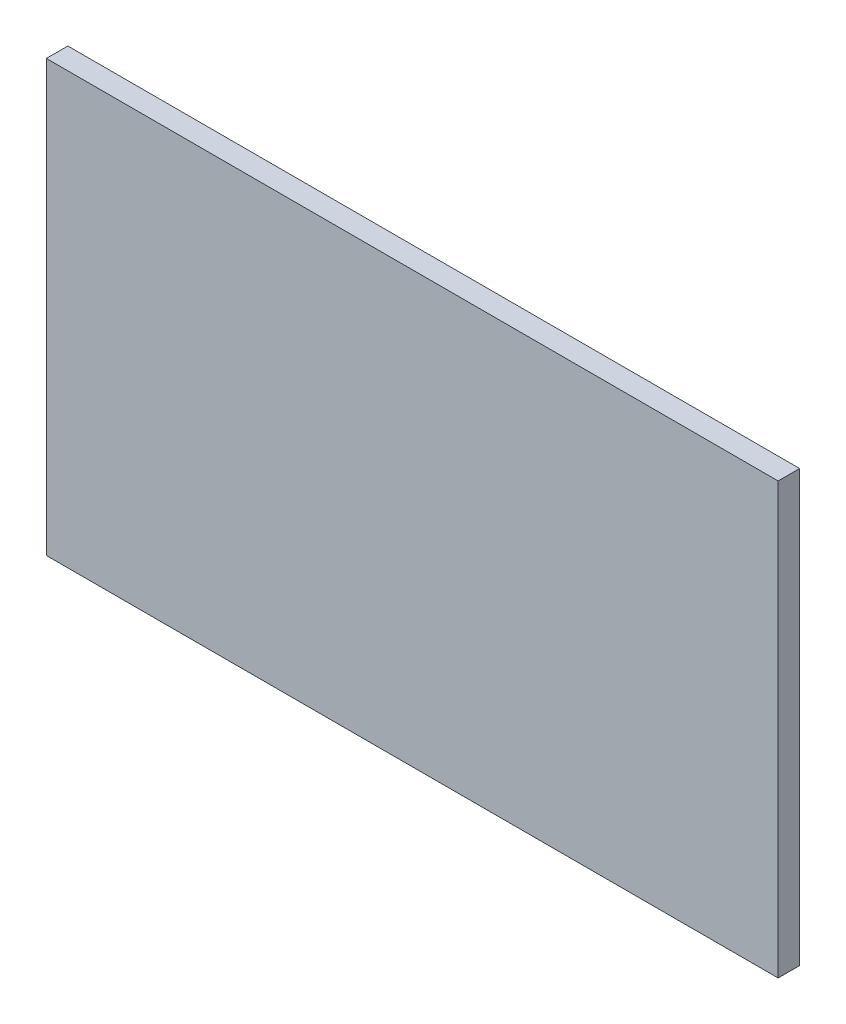
ISO-10303-21;
HEADER;
FILE_DESCRIPTION(('STEP AP214'),'2;1');
FILE_NAME('part.step','',(''),(''),'','','');
FILE_SCHEMA(('AUTOMOTIVE_DESIGN { 1 0 10303 214 1 1 1 1 }'));
ENDSEC;
DATA;
#1=APPLICATION_CONTEXT('core data for automotive mechanical design processes');
#2=APPLICATION_PROTOCOL_DEFINITION('international standard','automotive_design',2000,#1);
#3=PRODUCT_CONTEXT('',#1,'mechanical');
#4=PRODUCT('Part','Part','',(#3));
#5=PRODUCT_RELATED_PRODUCT_CATEGORY('part','',(#4));
#6=PRODUCT_DEFINITION_FORMATION('','',#4);
#7=PRODUCT_DEFINITION_CONTEXT('part definition',#1,'design');
#8=PRODUCT_DEFINITION('design','',#6,#7);
#9=PRODUCT_DEFINITION_SHAPE('','',#8);
#10=(LENGTH_UNIT() NAMED_UNIT(*) SI_UNIT(.MILLI.,.METRE.));
#11=(NAMED_UNIT(*) PLANE_ANGLE_UNIT() SI_UNIT($,.RADIAN.));
#12=(NAMED_UNIT(*) SI_UNIT($,.STERADIAN.) SOLID_ANGLE_UNIT());
#13=UNCERTAINTY_MEASURE_WITH_UNIT(LENGTH_MEASURE(1.E-05),#10,'distance_accuracy_value','');
#14=(GEOMETRIC_REPRESENTATION_CONTEXT(3) GLOBAL_UNCERTAINTY_ASSIGNED_CONTEXT((#13)) GLOBAL_UNIT_ASSIGNED_CONTEXT((#10,
#11,#12)) REPRESENTATION_CONTEXT('',''));
#15=CARTESIAN_POINT('',(0.,0.,0.));
#16=DIRECTION('',(0.,0.,1.));
#17=DIRECTION('',(1.,0.,0.));
#18=AXIS2_PLACEMENT_3D('',#15,#16,#17);
#19=CARTESIAN_POINT('',(-170.,-100.,10.));
#20=DIRECTION('',(1.,0.,0.));
#21=DIRECTION('',(0.,1.,0.));
#22=AXIS2_PLACEMENT_3D('',#19,#20,#21);
#23=PLANE('',#22);
#24=DIRECTION('',(0.,-1.,0.));
#25=VECTOR('',#24,1.);
#26=CARTESIAN_POINT('',(-170.,-100.,0.));
#27=LINE('',#26,#25);
#28=CARTESIAN_POINT('',(-170.,99.9999999999999,0.));
#29=VERTEX_POINT('',#28);
#30=CARTESIAN_POINT('',(-170.,-100.,0.));
#31=VERTEX_POINT('',#30);
#32=EDGE_CURVE('E98',#29,#31,#27,.T.);
#33=ORIENTED_EDGE('',*,*,#32,.T.);
#34=DIRECTION('',(0.,0.,-1.));
#35=VECTOR('',#34,1.);
#36=CARTESIAN_POINT('',(-170.,-100.,10.));
#37=LINE('',#36,#35);
#38=CARTESIAN_POINT('',(-170.,-100.,10.));
#39=VERTEX_POINT('',#38);
#40=EDGE_CURVE('E11',#39,#31,#37,.T.);
#41=ORIENTED_EDGE('',*,*,#40,.F.);
#42=DIRECTION('',(0.,-1.,0.));
#43=VECTOR('',#42,1.);
#44=CARTESIAN_POINT('',(-170.,-100.,10.));
#45=LINE('',#44,#43);
#46=CARTESIAN_POINT('',(-170.,99.9999999999999,10.));
#47=VERTEX_POINT('',#46);
#48=EDGE_CURVE('E86',#47,#39,#45,.T.);
#49=ORIENTED_EDGE('',*,*,#48,.F.);
#50=DIRECTION('',(0.,0.,-1.));
#51=VECTOR('',#50,1.);
#52=CARTESIAN_POINT('',(-170.,99.9999999999999,10.));
#53=LINE('',#52,#51);
#54=EDGE_CURVE('E94',#47,#29,#53,.T.);
#55=ORIENTED_EDGE('',*,*,#54,.T.);
#56=EDGE_LOOP('',(#33,#41,#49,#55));
#57=FACE_BOUND('',#56,.T.);
#58=ADVANCED_FACE('F35',(#57),#23,.F.);
#59=CARTESIAN_POINT('',(170.,-100.,10.));
#60=DIRECTION('',(0.,1.,0.));
#61=DIRECTION('',(-1.,0.,0.));
#62=AXIS2_PLACEMENT_3D('',#59,#60,#61);
#63=PLANE('',#62);
#64=DIRECTION('',(1.,0.,0.));
#65=VECTOR('',#64,1.);
#66=CARTESIAN_POINT('',(170.,-100.,0.));
#67=LINE('',#66,#65);
#68=CARTESIAN_POINT('',(170.,-100.,0.));
#69=VERTEX_POINT('',#68);
#70=EDGE_CURVE('E90',#31,#69,#67,.T.);
#71=ORIENTED_EDGE('',*,*,#70,.T.);
#72=DIRECTION('',(0.,0.,-1.));
#73=VECTOR('',#72,1.);
#74=CARTESIAN_POINT('',(170.,-100.,10.));
#75=LINE('',#74,#73);
#76=CARTESIAN_POINT('',(170.,-100.,10.));
#77=VERTEX_POINT('',#76);
#78=EDGE_CURVE('E43',#77,#69,#75,.T.);
#79=ORIENTED_EDGE('',*,*,#78,.F.);
#80=DIRECTION('',(1.,0.,0.));
#81=VECTOR('',#80,1.);
#82=CARTESIAN_POINT('',(170.,-100.,10.));
#83=LINE('',#82,#81);
#84=EDGE_CURVE('E81',#39,#77,#83,.T.);
#85=ORIENTED_EDGE('',*,*,#84,.F.);
#86=ORIENTED_EDGE('',*,*,#40,.T.);
#87=EDGE_LOOP('',(#71,#79,#85,#86));
#88=FACE_BOUND('',#87,.T.);
#89=ADVANCED_FACE('F89',(#88),#63,.F.);
#90=CARTESIAN_POINT('',(170.,-100.,10.));
#91=DIRECTION('',(-1.,0.,0.));
#92=DIRECTION('',(0.,0.,1.));
#93=AXIS2_PLACEMENT_3D('',#90,#91,#92);
#94=PLANE('',#93);
#95=DIRECTION('',(0.,1.,0.));
#96=VECTOR('',#95,1.);
#97=CARTESIAN_POINT('',(170.,-100.,0.));
#98=LINE('',#97,#96);
#99=CARTESIAN_POINT('',(170.,100.,0.));
#100=VERTEX_POINT('',#99);
#101=EDGE_CURVE('E68',#69,#100,#98,.T.);
#102=ORIENTED_EDGE('',*,*,#101,.T.);
#103=DIRECTION('',(0.,0.,-1.));
#104=VECTOR('',#103,1.);
#105=CARTESIAN_POINT('',(170.,100.,10.));
#106=LINE('',#105,#104);
#107=CARTESIAN_POINT('',(170.,100.,10.));
#108=VERTEX_POINT('',#107);
#109=EDGE_CURVE('E91',#108,#100,#106,.T.);
#110=ORIENTED_EDGE('',*,*,#109,.F.);
#111=DIRECTION('',(0.,1.,0.));
#112=VECTOR('',#111,1.);
#113=CARTESIAN_POINT('',(170.,-100.,10.));
#114=LINE('',#113,#112);
#115=EDGE_CURVE('E84',#77,#108,#114,.T.);
#116=ORIENTED_EDGE('',*,*,#115,.F.);
#117=ORIENTED_EDGE('',*,*,#78,.T.);
#118=EDGE_LOOP('',(#102,#110,#116,#117));
#119=FACE_BOUND('',#118,.T.);
#120=ADVANCED_FACE('F92',(#119),#94,.F.);
#121=CARTESIAN_POINT('',(170.,100.,10.));
#122=DIRECTION('',(0.,-1.,0.));
#123=DIRECTION('',(1.,0.,0.));
#124=AXIS2_PLACEMENT_3D('',#121,#122,#123);
#125=PLANE('',#124);
#126=DIRECTION('',(-1.,0.,0.));
#127=VECTOR('',#126,1.);
#128=CARTESIAN_POINT('',(170.,100.,0.));
#129=LINE('',#128,#127);
#130=EDGE_CURVE('E74',#100,#29,#129,.T.);
#131=ORIENTED_EDGE('',*,*,#130,.T.);
#132=ORIENTED_EDGE('',*,*,#54,.F.);
#133=DIRECTION('',(-1.,0.,0.));
#134=VECTOR('',#133,1.);
#135=CARTESIAN_POINT('',(170.,100.,10.));
#136=LINE('',#135,#134);
#137=EDGE_CURVE('E51',#108,#47,#136,.T.);
#138=ORIENTED_EDGE('',*,*,#137,.F.);
#139=ORIENTED_EDGE('',*,*,#109,.T.);
#140=EDGE_LOOP('',(#131,#132,#138,#139));
#141=FACE_BOUND('',#140,.T.);
#142=ADVANCED_FACE('F105',(#141),#125,.F.);
#143=CARTESIAN_POINT('',(0.,0.,10.));
#144=DIRECTION('',(0.,0.,1.));
#145=DIRECTION('',(1.,0.,0.));
#146=AXIS2_PLACEMENT_3D('',#143,#144,#145);
#147=PLANE('',#146);
#148=ORIENTED_EDGE('',*,*,#48,.T.);
#149=ORIENTED_EDGE('',*,*,#84,.T.);
#150=ORIENTED_EDGE('',*,*,#115,.T.);
#151=ORIENTED_EDGE('',*,*,#137,.T.);
#152=EDGE_LOOP('',(#148,#149,#150,#151));
#153=FACE_BOUND('',#152,.T.);
#154=ADVANCED_FACE('F82',(#153),#147,.T.);
#155=CARTESIAN_POINT('',(0.,0.,0.));
#156=DIRECTION('',(0.,0.,1.));
#157=DIRECTION('',(1.,0.,0.));
#158=AXIS2_PLACEMENT_3D('',#155,#156,#157);
#159=PLANE('',#158);
#160=ORIENTED_EDGE('',*,*,#32,.F.);
#161=ORIENTED_EDGE('',*,*,#130,.F.);
#162=ORIENTED_EDGE('',*,*,#101,.F.);
#163=ORIENTED_EDGE('',*,*,#70,.F.);
#164=EDGE_LOOP('',(#160,#161,#162,#163));
#165=FACE_BOUND('',#164,.T.);
#166=ADVANCED_FACE('F108',(#165),#159,.F.);
#167=CLOSED_SHELL('',(#58,#89,#120,#142,#154,#166));
#168=MANIFOLD_SOLID_BREP('B2',#167);
#169=ADVANCED_BREP_SHAPE_REPRESENTATION('',(#18,#168),#14);
#170=SHAPE_DEFINITION_REPRESENTATION(#9,#169);
ENDSEC;
END-ISO-10303-21;
